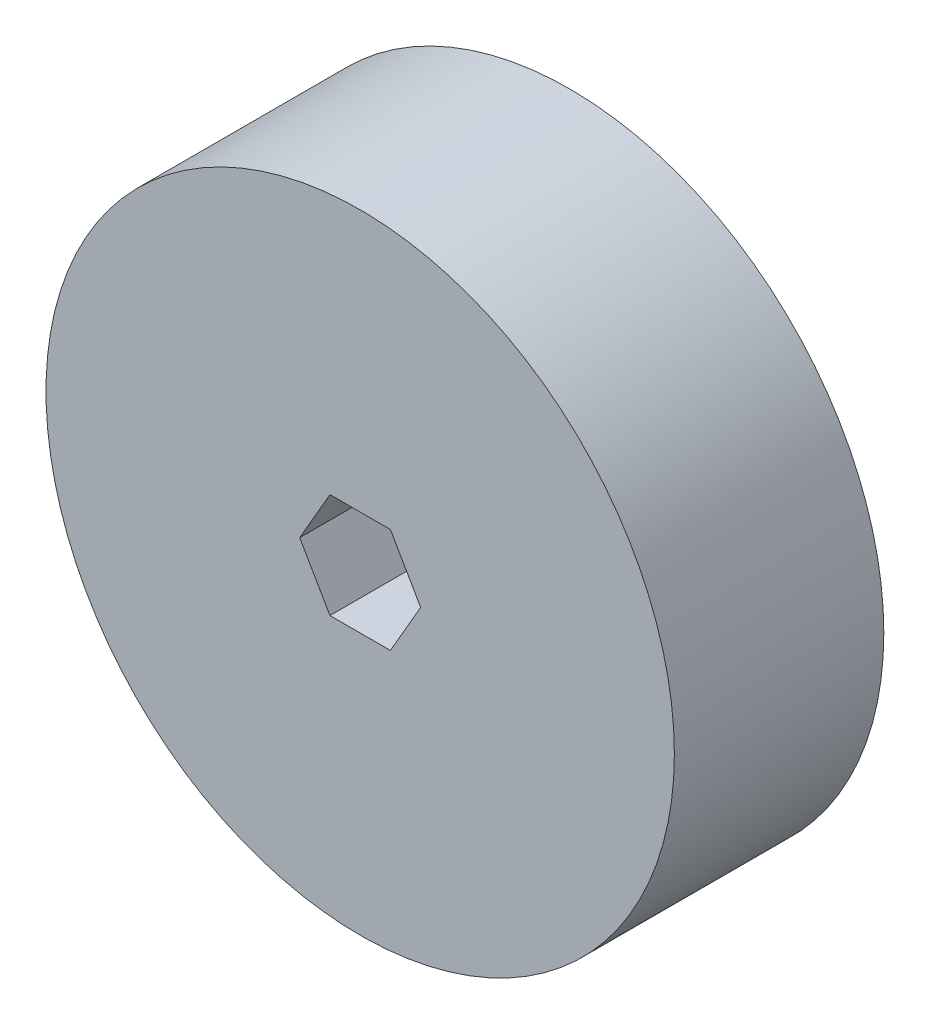
ISO-10303-21;
HEADER;
FILE_DESCRIPTION(('STEP AP214'),'2;1');
FILE_NAME('part.step','',(''),(''),'','','');
FILE_SCHEMA(('AUTOMOTIVE_DESIGN { 1 0 10303 214 1 1 1 1 }'));
ENDSEC;
DATA;
#1=APPLICATION_CONTEXT('core data for automotive mechanical design processes');
#2=APPLICATION_PROTOCOL_DEFINITION('international standard','automotive_design',2000,#1);
#3=PRODUCT_CONTEXT('',#1,'mechanical');
#4=PRODUCT('Part','Part','',(#3));
#5=PRODUCT_RELATED_PRODUCT_CATEGORY('part','',(#4));
#6=PRODUCT_DEFINITION_FORMATION('','',#4);
#7=PRODUCT_DEFINITION_CONTEXT('part definition',#1,'design');
#8=PRODUCT_DEFINITION('design','',#6,#7);
#9=PRODUCT_DEFINITION_SHAPE('','',#8);
#10=(LENGTH_UNIT() NAMED_UNIT(*) SI_UNIT(.MILLI.,.METRE.));
#11=(NAMED_UNIT(*) PLANE_ANGLE_UNIT() SI_UNIT($,.RADIAN.));
#12=(NAMED_UNIT(*) SI_UNIT($,.STERADIAN.) SOLID_ANGLE_UNIT());
#13=UNCERTAINTY_MEASURE_WITH_UNIT(LENGTH_MEASURE(1.E-05),#10,'distance_accuracy_value','');
#14=(GEOMETRIC_REPRESENTATION_CONTEXT(3) GLOBAL_UNCERTAINTY_ASSIGNED_CONTEXT((#13)) GLOBAL_UNIT_ASSIGNED_CONTEXT((#10,
#11,#12)) REPRESENTATION_CONTEXT('',''));
#15=CARTESIAN_POINT('',(0.,0.,0.));
#16=DIRECTION('',(0.,0.,1.));
#17=DIRECTION('',(1.,0.,0.));
#18=AXIS2_PLACEMENT_3D('',#15,#16,#17);
#19=CARTESIAN_POINT('',(0.,0.,25.4));
#20=DIRECTION('',(0.,0.,1.));
#21=DIRECTION('',(1.,0.,0.));
#22=AXIS2_PLACEMENT_3D('',#19,#20,#21);
#23=PLANE('',#22);
#24=CARTESIAN_POINT('',(0.,0.,25.4));
#25=DIRECTION('',(0.,0.,1.));
#26=DIRECTION('',(1.,0.,0.));
#27=AXIS2_PLACEMENT_3D('',#24,#25,#26);
#28=CIRCLE('',#27,38.1);
#29=CARTESIAN_POINT('',(38.1,0.,25.4));
#30=VERTEX_POINT('',#29);
#31=EDGE_CURVE('E11',#30,#30,#28,.T.);
#32=ORIENTED_EDGE('',*,*,#31,.T.);
#33=EDGE_LOOP('',(#32));
#34=FACE_BOUND('',#33,.T.);
#35=DIRECTION('',(0.5,-0.866025403784439,0.));
#36=VECTOR('',#35,1.);
#37=CARTESIAN_POINT('',(-7.33234841870825,0.,25.4));
#38=LINE('',#37,#36);
#39=CARTESIAN_POINT('',(-7.33234841870825,0.,25.4));
#40=VERTEX_POINT('',#39);
#41=CARTESIAN_POINT('',(-3.66617420935413,-6.35,25.4));
#42=VERTEX_POINT('',#41);
#43=EDGE_CURVE('E95',#40,#42,#38,.T.);
#44=ORIENTED_EDGE('',*,*,#43,.F.);
#45=DIRECTION('',(-0.499999999999999,-0.866025403784439,0.));
#46=VECTOR('',#45,1.);
#47=CARTESIAN_POINT('',(-3.66617420935413,6.35000000000002,25.4));
#48=LINE('',#47,#46);
#49=CARTESIAN_POINT('',(-3.66617420935413,6.35000000000002,25.4));
#50=VERTEX_POINT('',#49);
#51=EDGE_CURVE('E87',#50,#40,#48,.T.);
#52=ORIENTED_EDGE('',*,*,#51,.F.);
#53=DIRECTION('',(-1.,0.,0.));
#54=VECTOR('',#53,1.);
#55=CARTESIAN_POINT('',(3.66617420935409,6.35000000000002,25.4));
#56=LINE('',#55,#54);
#57=CARTESIAN_POINT('',(3.66617420935409,6.35000000000002,25.4));
#58=VERTEX_POINT('',#57);
#59=EDGE_CURVE('E115',#58,#50,#56,.T.);
#60=ORIENTED_EDGE('',*,*,#59,.F.);
#61=DIRECTION('',(-0.5,0.866025403784438,0.));
#62=VECTOR('',#61,1.);
#63=CARTESIAN_POINT('',(7.33234841870822,0.,25.4));
#64=LINE('',#63,#62);
#65=CARTESIAN_POINT('',(7.33234841870822,0.,25.4));
#66=VERTEX_POINT('',#65);
#67=EDGE_CURVE('E113',#66,#58,#64,.T.);
#68=ORIENTED_EDGE('',*,*,#67,.F.);
#69=DIRECTION('',(0.5,0.866025403784439,0.));
#70=VECTOR('',#69,1.);
#71=CARTESIAN_POINT('',(3.66617420935409,-6.35,25.4));
#72=LINE('',#71,#70);
#73=CARTESIAN_POINT('',(3.66617420935409,-6.35,25.4));
#74=VERTEX_POINT('',#73);
#75=EDGE_CURVE('E109',#74,#66,#72,.T.);
#76=ORIENTED_EDGE('',*,*,#75,.F.);
#77=DIRECTION('',(1.,0.,0.));
#78=VECTOR('',#77,1.);
#79=CARTESIAN_POINT('',(-3.66617420935413,-6.35,25.4));
#80=LINE('',#79,#78);
#81=EDGE_CURVE('E107',#42,#74,#80,.T.);
#82=ORIENTED_EDGE('',*,*,#81,.F.);
#83=EDGE_LOOP('',(#44,#52,#60,#68,#76,#82));
#84=FACE_BOUND('',#83,.T.);
#85=ADVANCED_FACE('F34',(#34,#84),#23,.T.);
#86=CARTESIAN_POINT('',(0.,0.,0.));
#87=DIRECTION('',(0.,0.,1.));
#88=DIRECTION('',(1.,0.,0.));
#89=AXIS2_PLACEMENT_3D('',#86,#87,#88);
#90=PLANE('',#89);
#91=CARTESIAN_POINT('',(0.,0.,0.));
#92=DIRECTION('',(0.,0.,1.));
#93=DIRECTION('',(1.,0.,0.));
#94=AXIS2_PLACEMENT_3D('',#91,#92,#93);
#95=CIRCLE('',#94,38.1);
#96=CARTESIAN_POINT('',(38.1,0.,0.));
#97=VERTEX_POINT('',#96);
#98=EDGE_CURVE('E38',#97,#97,#95,.T.);
#99=ORIENTED_EDGE('',*,*,#98,.F.);
#100=EDGE_LOOP('',(#99));
#101=FACE_BOUND('',#100,.T.);
#102=DIRECTION('',(-0.499999999999999,-0.866025403784439,0.));
#103=VECTOR('',#102,1.);
#104=CARTESIAN_POINT('',(-3.66617420935413,6.35000000000002,0.));
#105=LINE('',#104,#103);
#106=CARTESIAN_POINT('',(-3.66617420935413,6.35000000000002,0.));
#107=VERTEX_POINT('',#106);
#108=CARTESIAN_POINT('',(-7.33234841870825,0.,0.));
#109=VERTEX_POINT('',#108);
#110=EDGE_CURVE('E57',#107,#109,#105,.T.);
#111=ORIENTED_EDGE('',*,*,#110,.T.);
#112=DIRECTION('',(0.5,-0.866025403784439,0.));
#113=VECTOR('',#112,1.);
#114=CARTESIAN_POINT('',(-7.33234841870825,0.,0.));
#115=LINE('',#114,#113);
#116=CARTESIAN_POINT('',(-3.66617420935413,-6.35,0.));
#117=VERTEX_POINT('',#116);
#118=EDGE_CURVE('E102',#109,#117,#115,.T.);
#119=ORIENTED_EDGE('',*,*,#118,.T.);
#120=DIRECTION('',(1.,0.,0.));
#121=VECTOR('',#120,1.);
#122=CARTESIAN_POINT('',(-3.66617420935413,-6.35,0.));
#123=LINE('',#122,#121);
#124=CARTESIAN_POINT('',(3.66617420935409,-6.35,0.));
#125=VERTEX_POINT('',#124);
#126=EDGE_CURVE('E119',#117,#125,#123,.T.);
#127=ORIENTED_EDGE('',*,*,#126,.T.);
#128=DIRECTION('',(0.5,0.866025403784439,0.));
#129=VECTOR('',#128,1.);
#130=CARTESIAN_POINT('',(3.66617420935409,-6.35,0.));
#131=LINE('',#130,#129);
#132=CARTESIAN_POINT('',(7.33234841870822,0.,0.));
#133=VERTEX_POINT('',#132);
#134=EDGE_CURVE('E122',#125,#133,#131,.T.);
#135=ORIENTED_EDGE('',*,*,#134,.T.);
#136=DIRECTION('',(-0.5,0.866025403784438,0.));
#137=VECTOR('',#136,1.);
#138=CARTESIAN_POINT('',(7.33234841870822,0.,0.));
#139=LINE('',#138,#137);
#140=CARTESIAN_POINT('',(3.66617420935409,6.35000000000002,0.));
#141=VERTEX_POINT('',#140);
#142=EDGE_CURVE('E125',#133,#141,#139,.T.);
#143=ORIENTED_EDGE('',*,*,#142,.T.);
#144=DIRECTION('',(-1.,0.,0.));
#145=VECTOR('',#144,1.);
#146=CARTESIAN_POINT('',(3.66617420935409,6.35000000000002,0.));
#147=LINE('',#146,#145);
#148=EDGE_CURVE('E96',#141,#107,#147,.T.);
#149=ORIENTED_EDGE('',*,*,#148,.T.);
#150=EDGE_LOOP('',(#111,#119,#127,#135,#143,#149));
#151=FACE_BOUND('',#150,.T.);
#152=ADVANCED_FACE('F142',(#101,#151),#90,.F.);
#153=CARTESIAN_POINT('',(0.,0.,25.4));
#154=DIRECTION('',(0.,0.,-1.));
#155=DIRECTION('',(-1.,0.,0.));
#156=AXIS2_PLACEMENT_3D('',#153,#154,#155);
#157=CYLINDRICAL_SURFACE('',#156,38.1);
#158=ORIENTED_EDGE('',*,*,#31,.F.);
#159=EDGE_LOOP('',(#158));
#160=FACE_BOUND('',#159,.T.);
#161=ORIENTED_EDGE('',*,*,#98,.T.);
#162=EDGE_LOOP('',(#161));
#163=FACE_BOUND('',#162,.T.);
#164=ADVANCED_FACE('F36',(#160,#163),#157,.T.);
#165=CARTESIAN_POINT('',(-3.66617420935413,6.35000000000002,25.4));
#166=DIRECTION('',(0.866025403784439,-0.499999999999999,0.));
#167=DIRECTION('',(0.499999999999999,0.866025403784439,0.));
#168=AXIS2_PLACEMENT_3D('',#165,#166,#167);
#169=PLANE('',#168);
#170=ORIENTED_EDGE('',*,*,#110,.F.);
#171=DIRECTION('',(0.,0.,-1.));
#172=VECTOR('',#171,1.);
#173=CARTESIAN_POINT('',(-3.66617420935413,6.35000000000002,25.4));
#174=LINE('',#173,#172);
#175=EDGE_CURVE('E91',#50,#107,#174,.T.);
#176=ORIENTED_EDGE('',*,*,#175,.F.);
#177=ORIENTED_EDGE('',*,*,#51,.T.);
#178=DIRECTION('',(0.,0.,-1.));
#179=VECTOR('',#178,1.);
#180=CARTESIAN_POINT('',(-7.33234841870825,0.,25.4));
#181=LINE('',#180,#179);
#182=EDGE_CURVE('E90',#40,#109,#181,.T.);
#183=ORIENTED_EDGE('',*,*,#182,.T.);
#184=EDGE_LOOP('',(#170,#176,#177,#183));
#185=FACE_BOUND('',#184,.T.);
#186=ADVANCED_FACE('F89',(#185),#169,.T.);
#187=CARTESIAN_POINT('',(-7.33234841870825,0.,25.4));
#188=DIRECTION('',(0.866025403784439,0.5,0.));
#189=DIRECTION('',(-0.5,0.866025403784439,0.));
#190=AXIS2_PLACEMENT_3D('',#187,#188,#189);
#191=PLANE('',#190);
#192=ORIENTED_EDGE('',*,*,#118,.F.);
#193=ORIENTED_EDGE('',*,*,#182,.F.);
#194=ORIENTED_EDGE('',*,*,#43,.T.);
#195=DIRECTION('',(0.,0.,-1.));
#196=VECTOR('',#195,1.);
#197=CARTESIAN_POINT('',(-3.66617420935413,-6.35,25.4));
#198=LINE('',#197,#196);
#199=EDGE_CURVE('E103',#42,#117,#198,.T.);
#200=ORIENTED_EDGE('',*,*,#199,.T.);
#201=EDGE_LOOP('',(#192,#193,#194,#200));
#202=FACE_BOUND('',#201,.T.);
#203=ADVANCED_FACE('F99',(#202),#191,.T.);
#204=CARTESIAN_POINT('',(-3.66617420935413,-6.35,25.4));
#205=DIRECTION('',(0.,1.,0.));
#206=DIRECTION('',(0.,0.,1.));
#207=AXIS2_PLACEMENT_3D('',#204,#205,#206);
#208=PLANE('',#207);
#209=ORIENTED_EDGE('',*,*,#126,.F.);
#210=ORIENTED_EDGE('',*,*,#199,.F.);
#211=ORIENTED_EDGE('',*,*,#81,.T.);
#212=DIRECTION('',(0.,0.,-1.));
#213=VECTOR('',#212,1.);
#214=CARTESIAN_POINT('',(3.66617420935409,-6.35,25.4));
#215=LINE('',#214,#213);
#216=EDGE_CURVE('E134',#74,#125,#215,.T.);
#217=ORIENTED_EDGE('',*,*,#216,.T.);
#218=EDGE_LOOP('',(#209,#210,#211,#217));
#219=FACE_BOUND('',#218,.T.);
#220=ADVANCED_FACE('F138',(#219),#208,.T.);
#221=CARTESIAN_POINT('',(3.66617420935409,-6.35,25.4));
#222=DIRECTION('',(-0.866025403784439,0.5,0.));
#223=DIRECTION('',(-0.5,-0.866025403784439,0.));
#224=AXIS2_PLACEMENT_3D('',#221,#222,#223);
#225=PLANE('',#224);
#226=ORIENTED_EDGE('',*,*,#134,.F.);
#227=ORIENTED_EDGE('',*,*,#216,.F.);
#228=ORIENTED_EDGE('',*,*,#75,.T.);
#229=DIRECTION('',(0.,0.,-1.));
#230=VECTOR('',#229,1.);
#231=CARTESIAN_POINT('',(7.33234841870822,0.,25.4));
#232=LINE('',#231,#230);
#233=EDGE_CURVE('E132',#66,#133,#232,.T.);
#234=ORIENTED_EDGE('',*,*,#233,.T.);
#235=EDGE_LOOP('',(#226,#227,#228,#234));
#236=FACE_BOUND('',#235,.T.);
#237=ADVANCED_FACE('F150',(#236),#225,.T.);
#238=CARTESIAN_POINT('',(7.33234841870822,0.,25.4));
#239=DIRECTION('',(-0.866025403784439,-0.5,0.));
#240=DIRECTION('',(0.5,-0.866025403784439,0.));
#241=AXIS2_PLACEMENT_3D('',#238,#239,#240);
#242=PLANE('',#241);
#243=ORIENTED_EDGE('',*,*,#142,.F.);
#244=ORIENTED_EDGE('',*,*,#233,.F.);
#245=ORIENTED_EDGE('',*,*,#67,.T.);
#246=DIRECTION('',(0.,0.,-1.));
#247=VECTOR('',#246,1.);
#248=CARTESIAN_POINT('',(3.66617420935409,6.35000000000002,25.4));
#249=LINE('',#248,#247);
#250=EDGE_CURVE('E49',#58,#141,#249,.T.);
#251=ORIENTED_EDGE('',*,*,#250,.T.);
#252=EDGE_LOOP('',(#243,#244,#245,#251));
#253=FACE_BOUND('',#252,.T.);
#254=ADVANCED_FACE('F148',(#253),#242,.T.);
#255=CARTESIAN_POINT('',(3.66617420935409,6.35000000000002,25.4));
#256=DIRECTION('',(0.,-1.,0.));
#257=DIRECTION('',(0.,0.,-1.));
#258=AXIS2_PLACEMENT_3D('',#255,#256,#257);
#259=PLANE('',#258);
#260=ORIENTED_EDGE('',*,*,#148,.F.);
#261=ORIENTED_EDGE('',*,*,#250,.F.);
#262=ORIENTED_EDGE('',*,*,#59,.T.);
#263=ORIENTED_EDGE('',*,*,#175,.T.);
#264=EDGE_LOOP('',(#260,#261,#262,#263));
#265=FACE_BOUND('',#264,.T.);
#266=ADVANCED_FACE('F144',(#265),#259,.T.);
#267=CLOSED_SHELL('',(#85,#152,#164,#186,#203,#220,#237,#254,#266));
#268=MANIFOLD_SOLID_BREP('B2',#267);
#269=ADVANCED_BREP_SHAPE_REPRESENTATION('',(#18,#268),#14);
#270=SHAPE_DEFINITION_REPRESENTATION(#9,#269);
ENDSEC;
END-ISO-10303-21;
